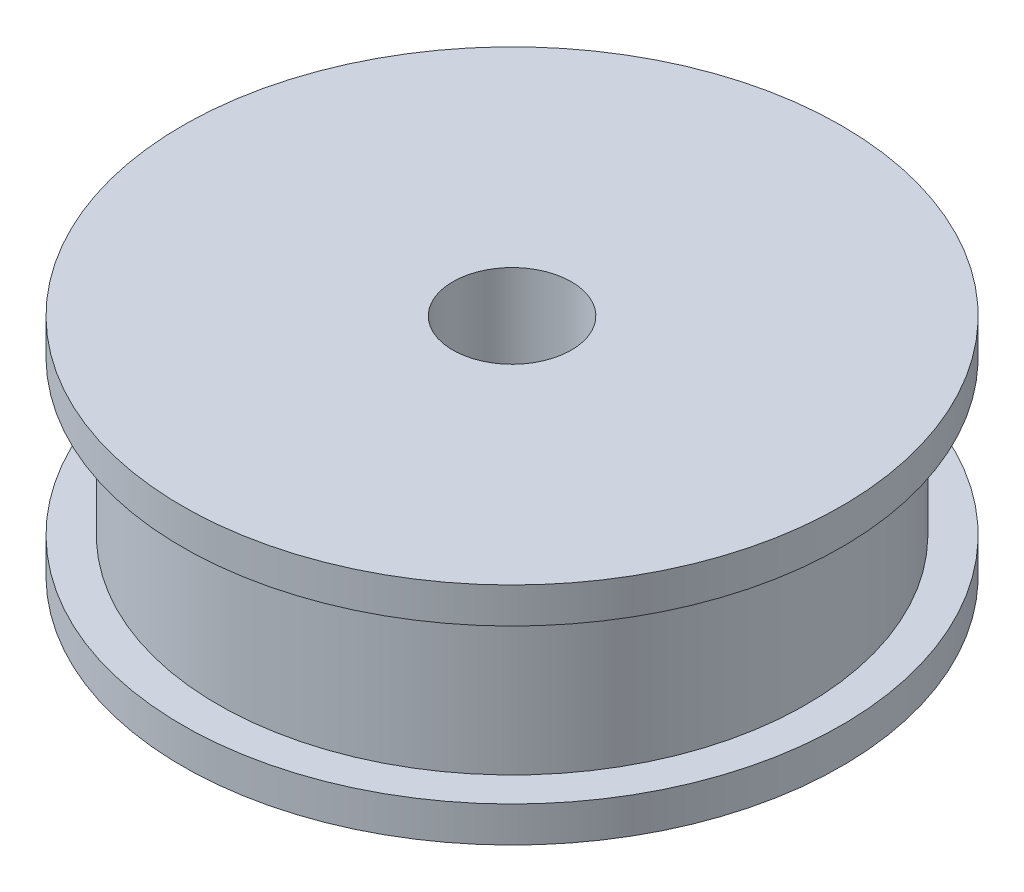
ISO-10303-21;
HEADER;
FILE_DESCRIPTION(('STEP AP214'),'2;1');
FILE_NAME('part.step','',(''),(''),'','','');
FILE_SCHEMA(('AUTOMOTIVE_DESIGN { 1 0 10303 214 1 1 1 1 }'));
ENDSEC;
DATA;
#1=APPLICATION_CONTEXT('core data for automotive mechanical design processes');
#2=APPLICATION_PROTOCOL_DEFINITION('international standard','automotive_design',2000,#1);
#3=PRODUCT_CONTEXT('',#1,'mechanical');
#4=PRODUCT('Part','Part','',(#3));
#5=PRODUCT_RELATED_PRODUCT_CATEGORY('part','',(#4));
#6=PRODUCT_DEFINITION_FORMATION('','',#4);
#7=PRODUCT_DEFINITION_CONTEXT('part definition',#1,'design');
#8=PRODUCT_DEFINITION('design','',#6,#7);
#9=PRODUCT_DEFINITION_SHAPE('','',#8);
#10=(LENGTH_UNIT() NAMED_UNIT(*) SI_UNIT(.MILLI.,.METRE.));
#11=(NAMED_UNIT(*) PLANE_ANGLE_UNIT() SI_UNIT($,.RADIAN.));
#12=(NAMED_UNIT(*) SI_UNIT($,.STERADIAN.) SOLID_ANGLE_UNIT());
#13=UNCERTAINTY_MEASURE_WITH_UNIT(LENGTH_MEASURE(1.E-05),#10,'distance_accuracy_value','');
#14=(GEOMETRIC_REPRESENTATION_CONTEXT(3) GLOBAL_UNCERTAINTY_ASSIGNED_CONTEXT((#13)) GLOBAL_UNIT_ASSIGNED_CONTEXT((#10,
#11,#12)) REPRESENTATION_CONTEXT('',''));
#15=CARTESIAN_POINT('',(0.,0.,0.));
#16=DIRECTION('',(0.,0.,1.));
#17=DIRECTION('',(1.,0.,0.));
#18=AXIS2_PLACEMENT_3D('',#15,#16,#17);
#19=CARTESIAN_POINT('',(0.,0.,0.));
#20=DIRECTION('',(0.,-1.,0.));
#21=DIRECTION('',(0.,0.,-1.));
#22=AXIS2_PLACEMENT_3D('',#19,#20,#21);
#23=CYLINDRICAL_SURFACE('',#22,2.5);
#24=CARTESIAN_POINT('',(0.,0.,0.));
#25=DIRECTION('',(0.,-1.,0.));
#26=DIRECTION('',(0.,0.,-1.));
#27=AXIS2_PLACEMENT_3D('',#24,#25,#26);
#28=CIRCLE('',#27,2.5);
#29=CARTESIAN_POINT('',(0.,0.,-2.5));
#30=VERTEX_POINT('',#29);
#31=EDGE_CURVE('E10',#30,#30,#28,.T.);
#32=ORIENTED_EDGE('',*,*,#31,.T.);
#33=EDGE_LOOP('',(#32));
#34=FACE_BOUND('',#33,.T.);
#35=CARTESIAN_POINT('',(0.,9.5,0.));
#36=DIRECTION('',(0.,-1.,0.));
#37=DIRECTION('',(0.,0.,-1.));
#38=AXIS2_PLACEMENT_3D('',#35,#36,#37);
#39=CIRCLE('',#38,2.5);
#40=CARTESIAN_POINT('',(0.,9.5,-2.5));
#41=VERTEX_POINT('',#40);
#42=EDGE_CURVE('E59',#41,#41,#39,.T.);
#43=ORIENTED_EDGE('',*,*,#42,.F.);
#44=EDGE_LOOP('',(#43));
#45=FACE_BOUND('',#44,.T.);
#46=ADVANCED_FACE('F31',(#34,#45),#23,.F.);
#47=CARTESIAN_POINT('',(2.5,0.,0.));
#48=DIRECTION('',(0.,-1.,0.));
#49=DIRECTION('',(0.,0.,-1.));
#50=AXIS2_PLACEMENT_3D('',#47,#48,#49);
#51=PLANE('',#50);
#52=CARTESIAN_POINT('',(0.,0.,0.));
#53=DIRECTION('',(0.,-1.,0.));
#54=DIRECTION('',(0.,0.,-1.));
#55=AXIS2_PLACEMENT_3D('',#52,#53,#54);
#56=CIRCLE('',#55,13.9);
#57=CARTESIAN_POINT('',(0.,0.,-13.9));
#58=VERTEX_POINT('',#57);
#59=EDGE_CURVE('E37',#58,#58,#56,.T.);
#60=ORIENTED_EDGE('',*,*,#59,.T.);
#61=EDGE_LOOP('',(#60));
#62=FACE_BOUND('',#61,.T.);
#63=ORIENTED_EDGE('',*,*,#31,.F.);
#64=EDGE_LOOP('',(#63));
#65=FACE_BOUND('',#64,.T.);
#66=ADVANCED_FACE('F67',(#62,#65),#51,.T.);
#67=CARTESIAN_POINT('',(0.,0.,0.));
#68=DIRECTION('',(0.,-1.,0.));
#69=DIRECTION('',(0.,0.,-1.));
#70=AXIS2_PLACEMENT_3D('',#67,#68,#69);
#71=CYLINDRICAL_SURFACE('',#70,13.9);
#72=CARTESIAN_POINT('',(0.,1.5,0.));
#73=DIRECTION('',(0.,-1.,0.));
#74=DIRECTION('',(0.,0.,-1.));
#75=AXIS2_PLACEMENT_3D('',#72,#73,#74);
#76=CIRCLE('',#75,13.9);
#77=CARTESIAN_POINT('',(0.,1.5,-13.9));
#78=VERTEX_POINT('',#77);
#79=EDGE_CURVE('E41',#78,#78,#76,.T.);
#80=ORIENTED_EDGE('',*,*,#79,.T.);
#81=EDGE_LOOP('',(#80));
#82=FACE_BOUND('',#81,.T.);
#83=ORIENTED_EDGE('',*,*,#59,.F.);
#84=EDGE_LOOP('',(#83));
#85=FACE_BOUND('',#84,.T.);
#86=ADVANCED_FACE('F71',(#82,#85),#71,.T.);
#87=CARTESIAN_POINT('',(13.9,1.5,0.));
#88=DIRECTION('',(0.,1.,0.));
#89=DIRECTION('',(0.,0.,1.));
#90=AXIS2_PLACEMENT_3D('',#87,#88,#89);
#91=PLANE('',#90);
#92=CARTESIAN_POINT('',(0.,1.5,0.));
#93=DIRECTION('',(0.,-1.,0.));
#94=DIRECTION('',(0.,0.,-1.));
#95=AXIS2_PLACEMENT_3D('',#92,#93,#94);
#96=CIRCLE('',#95,12.4);
#97=CARTESIAN_POINT('',(0.,1.5,-12.4));
#98=VERTEX_POINT('',#97);
#99=EDGE_CURVE('E45',#98,#98,#96,.T.);
#100=ORIENTED_EDGE('',*,*,#99,.T.);
#101=EDGE_LOOP('',(#100));
#102=FACE_BOUND('',#101,.T.);
#103=ORIENTED_EDGE('',*,*,#79,.F.);
#104=EDGE_LOOP('',(#103));
#105=FACE_BOUND('',#104,.T.);
#106=ADVANCED_FACE('F75',(#102,#105),#91,.T.);
#107=CARTESIAN_POINT('',(0.,0.,0.));
#108=DIRECTION('',(0.,-1.,0.));
#109=DIRECTION('',(0.,0.,-1.));
#110=AXIS2_PLACEMENT_3D('',#107,#108,#109);
#111=CYLINDRICAL_SURFACE('',#110,12.4);
#112=CARTESIAN_POINT('',(0.,8.,0.));
#113=DIRECTION('',(0.,-1.,0.));
#114=DIRECTION('',(0.,0.,-1.));
#115=AXIS2_PLACEMENT_3D('',#112,#113,#114);
#116=CIRCLE('',#115,12.4);
#117=CARTESIAN_POINT('',(0.,8.,-12.4));
#118=VERTEX_POINT('',#117);
#119=EDGE_CURVE('E50',#118,#118,#116,.T.);
#120=ORIENTED_EDGE('',*,*,#119,.T.);
#121=EDGE_LOOP('',(#120));
#122=FACE_BOUND('',#121,.T.);
#123=ORIENTED_EDGE('',*,*,#99,.F.);
#124=EDGE_LOOP('',(#123));
#125=FACE_BOUND('',#124,.T.);
#126=ADVANCED_FACE('F82',(#122,#125),#111,.T.);
#127=CARTESIAN_POINT('',(12.4,8.,0.));
#128=DIRECTION('',(0.,-1.,0.));
#129=DIRECTION('',(0.,0.,-1.));
#130=AXIS2_PLACEMENT_3D('',#127,#128,#129);
#131=PLANE('',#130);
#132=CARTESIAN_POINT('',(0.,8.,0.));
#133=DIRECTION('',(0.,-1.,0.));
#134=DIRECTION('',(0.,0.,-1.));
#135=AXIS2_PLACEMENT_3D('',#132,#133,#134);
#136=CIRCLE('',#135,13.9);
#137=CARTESIAN_POINT('',(0.,8.,-13.9));
#138=VERTEX_POINT('',#137);
#139=EDGE_CURVE('E53',#138,#138,#136,.T.);
#140=ORIENTED_EDGE('',*,*,#139,.T.);
#141=EDGE_LOOP('',(#140));
#142=FACE_BOUND('',#141,.T.);
#143=ORIENTED_EDGE('',*,*,#119,.F.);
#144=EDGE_LOOP('',(#143));
#145=FACE_BOUND('',#144,.T.);
#146=ADVANCED_FACE('F86',(#142,#145),#131,.T.);
#147=CARTESIAN_POINT('',(0.,0.,0.));
#148=DIRECTION('',(0.,-1.,0.));
#149=DIRECTION('',(0.,0.,-1.));
#150=AXIS2_PLACEMENT_3D('',#147,#148,#149);
#151=CYLINDRICAL_SURFACE('',#150,13.9);
#152=CARTESIAN_POINT('',(0.,9.5,0.));
#153=DIRECTION('',(0.,-1.,0.));
#154=DIRECTION('',(0.,0.,-1.));
#155=AXIS2_PLACEMENT_3D('',#152,#153,#154);
#156=CIRCLE('',#155,13.9);
#157=CARTESIAN_POINT('',(0.,9.5,-13.9));
#158=VERTEX_POINT('',#157);
#159=EDGE_CURVE('E56',#158,#158,#156,.T.);
#160=ORIENTED_EDGE('',*,*,#159,.T.);
#161=EDGE_LOOP('',(#160));
#162=FACE_BOUND('',#161,.T.);
#163=ORIENTED_EDGE('',*,*,#139,.F.);
#164=EDGE_LOOP('',(#163));
#165=FACE_BOUND('',#164,.T.);
#166=ADVANCED_FACE('F90',(#162,#165),#151,.T.);
#167=CARTESIAN_POINT('',(13.9,9.5,0.));
#168=DIRECTION('',(0.,1.,0.));
#169=DIRECTION('',(0.,0.,1.));
#170=AXIS2_PLACEMENT_3D('',#167,#168,#169);
#171=PLANE('',#170);
#172=ORIENTED_EDGE('',*,*,#42,.T.);
#173=EDGE_LOOP('',(#172));
#174=FACE_BOUND('',#173,.T.);
#175=ORIENTED_EDGE('',*,*,#159,.F.);
#176=EDGE_LOOP('',(#175));
#177=FACE_BOUND('',#176,.T.);
#178=ADVANCED_FACE('F63',(#174,#177),#171,.T.);
#179=CLOSED_SHELL('',(#46,#66,#86,#106,#126,#146,#166,#178));
#180=MANIFOLD_SOLID_BREP('B2',#179);
#181=ADVANCED_BREP_SHAPE_REPRESENTATION('',(#18,#180),#14);
#182=SHAPE_DEFINITION_REPRESENTATION(#9,#181);
ENDSEC;
END-ISO-10303-21;
